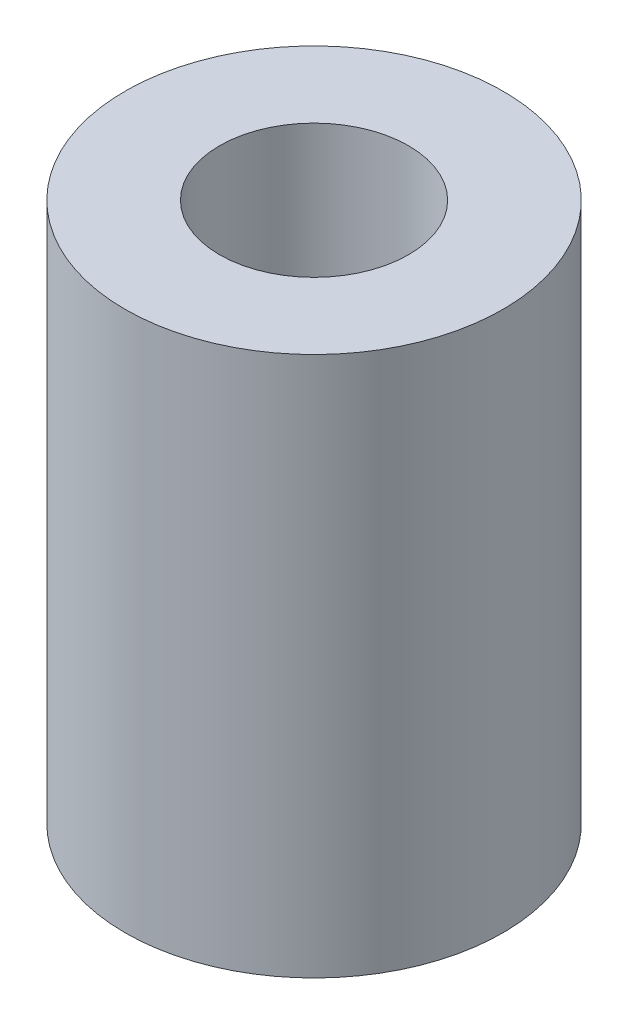
ISO-10303-21;
HEADER;
FILE_DESCRIPTION(('STEP AP214'),'2;1');
FILE_NAME('part.step','',(''),(''),'','','');
FILE_SCHEMA(('AUTOMOTIVE_DESIGN { 1 0 10303 214 1 1 1 1 }'));
ENDSEC;
DATA;
#1=APPLICATION_CONTEXT('core data for automotive mechanical design processes');
#2=APPLICATION_PROTOCOL_DEFINITION('international standard','automotive_design',2000,#1);
#3=PRODUCT_CONTEXT('',#1,'mechanical');
#4=PRODUCT('Part','Part','',(#3));
#5=PRODUCT_RELATED_PRODUCT_CATEGORY('part','',(#4));
#6=PRODUCT_DEFINITION_FORMATION('','',#4);
#7=PRODUCT_DEFINITION_CONTEXT('part definition',#1,'design');
#8=PRODUCT_DEFINITION('design','',#6,#7);
#9=PRODUCT_DEFINITION_SHAPE('','',#8);
#10=(LENGTH_UNIT() NAMED_UNIT(*) SI_UNIT(.MILLI.,.METRE.));
#11=(NAMED_UNIT(*) PLANE_ANGLE_UNIT() SI_UNIT($,.RADIAN.));
#12=(NAMED_UNIT(*) SI_UNIT($,.STERADIAN.) SOLID_ANGLE_UNIT());
#13=UNCERTAINTY_MEASURE_WITH_UNIT(LENGTH_MEASURE(1.E-05),#10,'distance_accuracy_value','');
#14=(GEOMETRIC_REPRESENTATION_CONTEXT(3) GLOBAL_UNCERTAINTY_ASSIGNED_CONTEXT((#13)) GLOBAL_UNIT_ASSIGNED_CONTEXT((#10,
#11,#12)) REPRESENTATION_CONTEXT('',''));
#15=CARTESIAN_POINT('',(0.,0.,0.));
#16=DIRECTION('',(0.,0.,1.));
#17=DIRECTION('',(1.,0.,0.));
#18=AXIS2_PLACEMENT_3D('',#15,#16,#17);
#19=CARTESIAN_POINT('',(0.,10.,0.));
#20=DIRECTION('',(0.,1.,0.));
#21=DIRECTION('',(0.,0.,1.));
#22=AXIS2_PLACEMENT_3D('',#19,#20,#21);
#23=PLANE('',#22);
#24=CARTESIAN_POINT('',(0.,10.,0.));
#25=DIRECTION('',(0.,1.,0.));
#26=DIRECTION('',(0.,0.,1.));
#27=AXIS2_PLACEMENT_3D('',#24,#25,#26);
#28=CIRCLE('',#27,3.5);
#29=CARTESIAN_POINT('',(0.,10.,3.5));
#30=VERTEX_POINT('',#29);
#31=EDGE_CURVE('E10',#30,#30,#28,.T.);
#32=ORIENTED_EDGE('',*,*,#31,.T.);
#33=EDGE_LOOP('',(#32));
#34=FACE_BOUND('',#33,.T.);
#35=CARTESIAN_POINT('',(0.,10.,0.));
#36=DIRECTION('',(0.,1.,0.));
#37=DIRECTION('',(0.,0.,1.));
#38=AXIS2_PLACEMENT_3D('',#35,#36,#37);
#39=CIRCLE('',#38,1.75);
#40=CARTESIAN_POINT('',(0.,10.,1.75));
#41=VERTEX_POINT('',#40);
#42=EDGE_CURVE('E43',#41,#41,#39,.T.);
#43=ORIENTED_EDGE('',*,*,#42,.F.);
#44=EDGE_LOOP('',(#43));
#45=FACE_BOUND('',#44,.T.);
#46=ADVANCED_FACE('F32',(#34,#45),#23,.T.);
#47=CARTESIAN_POINT('',(0.,0.,0.));
#48=DIRECTION('',(0.,1.,0.));
#49=DIRECTION('',(0.,0.,1.));
#50=AXIS2_PLACEMENT_3D('',#47,#48,#49);
#51=PLANE('',#50);
#52=CARTESIAN_POINT('',(0.,0.,0.));
#53=DIRECTION('',(0.,1.,0.));
#54=DIRECTION('',(0.,0.,1.));
#55=AXIS2_PLACEMENT_3D('',#52,#53,#54);
#56=CIRCLE('',#55,3.5);
#57=CARTESIAN_POINT('',(0.,0.,3.5));
#58=VERTEX_POINT('',#57);
#59=EDGE_CURVE('E36',#58,#58,#56,.T.);
#60=ORIENTED_EDGE('',*,*,#59,.F.);
#61=EDGE_LOOP('',(#60));
#62=FACE_BOUND('',#61,.T.);
#63=CARTESIAN_POINT('',(0.,0.,0.));
#64=DIRECTION('',(0.,1.,0.));
#65=DIRECTION('',(0.,0.,1.));
#66=AXIS2_PLACEMENT_3D('',#63,#64,#65);
#67=CIRCLE('',#66,1.75);
#68=CARTESIAN_POINT('',(0.,0.,1.75));
#69=VERTEX_POINT('',#68);
#70=EDGE_CURVE('E45',#69,#69,#67,.T.);
#71=ORIENTED_EDGE('',*,*,#70,.T.);
#72=EDGE_LOOP('',(#71));
#73=FACE_BOUND('',#72,.T.);
#74=ADVANCED_FACE('F55',(#62,#73),#51,.F.);
#75=CARTESIAN_POINT('',(0.,10.,0.));
#76=DIRECTION('',(0.,-1.,0.));
#77=DIRECTION('',(0.,0.,-1.));
#78=AXIS2_PLACEMENT_3D('',#75,#76,#77);
#79=CYLINDRICAL_SURFACE('',#78,3.5);
#80=ORIENTED_EDGE('',*,*,#31,.F.);
#81=EDGE_LOOP('',(#80));
#82=FACE_BOUND('',#81,.T.);
#83=ORIENTED_EDGE('',*,*,#59,.T.);
#84=EDGE_LOOP('',(#83));
#85=FACE_BOUND('',#84,.T.);
#86=ADVANCED_FACE('F34',(#82,#85),#79,.T.);
#87=CARTESIAN_POINT('',(0.,10.,0.));
#88=DIRECTION('',(0.,-1.,0.));
#89=DIRECTION('',(0.,0.,-1.));
#90=AXIS2_PLACEMENT_3D('',#87,#88,#89);
#91=CYLINDRICAL_SURFACE('',#90,1.75);
#92=ORIENTED_EDGE('',*,*,#42,.T.);
#93=EDGE_LOOP('',(#92));
#94=FACE_BOUND('',#93,.T.);
#95=ORIENTED_EDGE('',*,*,#70,.F.);
#96=EDGE_LOOP('',(#95));
#97=FACE_BOUND('',#96,.T.);
#98=ADVANCED_FACE('F51',(#94,#97),#91,.F.);
#99=CLOSED_SHELL('',(#46,#74,#86,#98));
#100=MANIFOLD_SOLID_BREP('B2',#99);
#101=ADVANCED_BREP_SHAPE_REPRESENTATION('',(#18,#100),#14);
#102=SHAPE_DEFINITION_REPRESENTATION(#9,#101);
ENDSEC;
END-ISO-10303-21;
